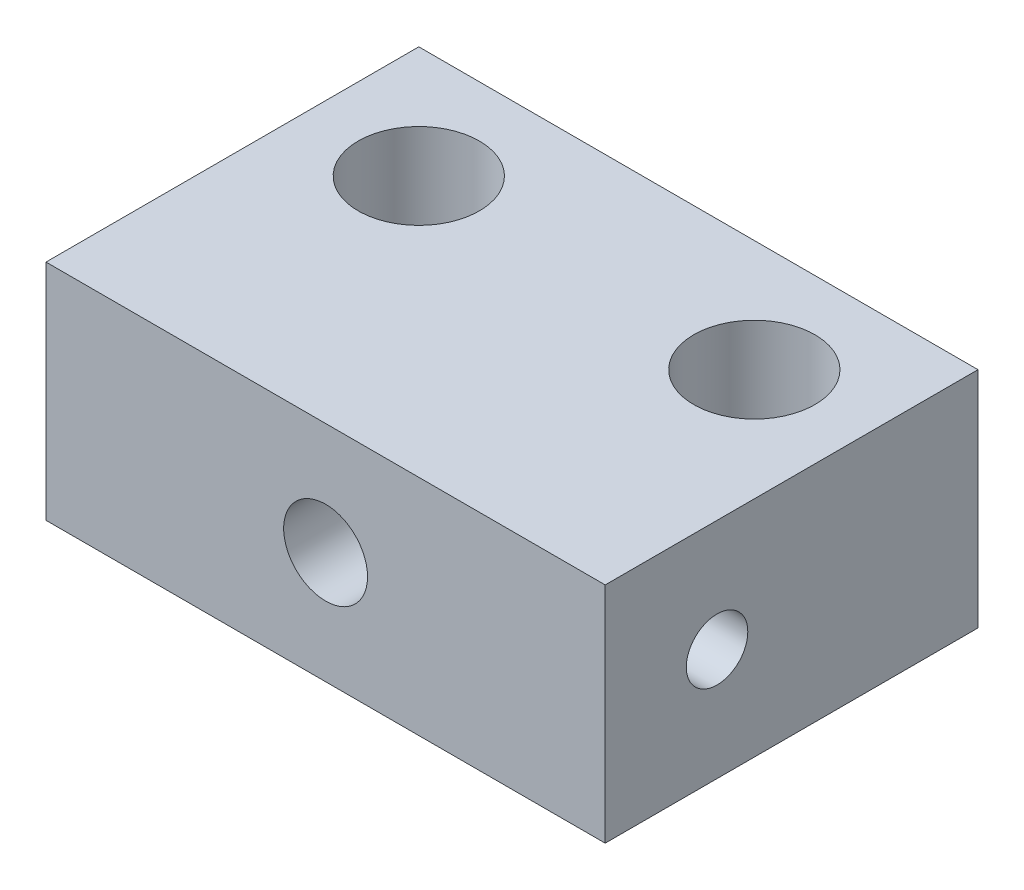
ISO-10303-21;
HEADER;
FILE_DESCRIPTION(('STEP AP214'),'2;1');
FILE_NAME('part.step','',(''),(''),'','','');
FILE_SCHEMA(('AUTOMOTIVE_DESIGN { 1 0 10303 214 1 1 1 1 }'));
ENDSEC;
DATA;
#1=APPLICATION_CONTEXT('core data for automotive mechanical design processes');
#2=APPLICATION_PROTOCOL_DEFINITION('international standard','automotive_design',2000,#1);
#3=PRODUCT_CONTEXT('',#1,'mechanical');
#4=PRODUCT('Part','Part','',(#3));
#5=PRODUCT_RELATED_PRODUCT_CATEGORY('part','',(#4));
#6=PRODUCT_DEFINITION_FORMATION('','',#4);
#7=PRODUCT_DEFINITION_CONTEXT('part definition',#1,'design');
#8=PRODUCT_DEFINITION('design','',#6,#7);
#9=PRODUCT_DEFINITION_SHAPE('','',#8);
#10=(LENGTH_UNIT() NAMED_UNIT(*) SI_UNIT(.MILLI.,.METRE.));
#11=(NAMED_UNIT(*) PLANE_ANGLE_UNIT() SI_UNIT($,.RADIAN.));
#12=(NAMED_UNIT(*) SI_UNIT($,.STERADIAN.) SOLID_ANGLE_UNIT());
#13=UNCERTAINTY_MEASURE_WITH_UNIT(LENGTH_MEASURE(1.E-05),#10,'distance_accuracy_value','');
#14=(GEOMETRIC_REPRESENTATION_CONTEXT(3) GLOBAL_UNCERTAINTY_ASSIGNED_CONTEXT((#13)) GLOBAL_UNIT_ASSIGNED_CONTEXT((#10,
#11,#12)) REPRESENTATION_CONTEXT('',''));
#15=CARTESIAN_POINT('',(0.,0.,0.));
#16=DIRECTION('',(0.,0.,1.));
#17=DIRECTION('',(1.,0.,0.));
#18=AXIS2_PLACEMENT_3D('',#15,#16,#17);
#19=CARTESIAN_POINT('',(15.0000000000001,0.,4.));
#20=DIRECTION('',(1.,0.,0.));
#21=DIRECTION('',(0.,0.,-1.));
#22=AXIS2_PLACEMENT_3D('',#19,#20,#21);
#23=CYLINDRICAL_SURFACE('',#22,1.65);
#24=CARTESIAN_POINT('',(2.25,0.,2.35));
#25=CARTESIAN_POINT('',(2.2499938138554,-0.0810313457488097,2.35000646243822));
#26=CARTESIAN_POINT('',(2.2455777235023,-0.162163120412216,2.35601476654126));
#27=CARTESIAN_POINT('',(2.2283156526284,-0.321859784676765,2.37967490389228));
#28=CARTESIAN_POINT('',(2.21545312282857,-0.40041931653312,2.39734959568061));
#29=CARTESIAN_POINT('',(2.18254266653747,-0.552278539991181,2.44316200012965));
#30=CARTESIAN_POINT('',(2.16253614926498,-0.625605680848924,2.47123944906144));
#31=CARTESIAN_POINT('',(2.11686292416083,-0.766063665025595,2.53656128797815));
#32=CARTESIAN_POINT('',(2.0911970970119,-0.833195470138582,2.57380425176111));
#33=CARTESIAN_POINT('',(2.03332947824902,-0.966337940887485,2.66002002177325));
#34=CARTESIAN_POINT('',(2.00074481564817,-1.03168607871456,2.70975352959745));
#35=CARTESIAN_POINT('',(1.93297687470046,-1.15368201193867,2.817562435368));
#36=CARTESIAN_POINT('',(1.89778965397867,-1.21031619045113,2.87565062017346));
#37=CARTESIAN_POINT('',(1.82032302518825,-1.32459659823451,3.01142025161559));
#38=CARTESIAN_POINT('',(1.7779939118285,-1.38030170191105,3.09071573999114));
#39=CARTESIAN_POINT('',(1.6978630863653,-1.47774276372248,3.25956249568834));
#40=CARTESIAN_POINT('',(1.66005473056947,-1.51949938662037,3.34909832530881));
#41=CARTESIAN_POINT('',(1.60632388084195,-1.57581950437787,3.50629459970161));
#42=CARTESIAN_POINT('',(1.58730710010319,-1.59480773647515,3.57129759323593));
#43=CARTESIAN_POINT('',(1.55659712234633,-1.62479879602515,3.70473151687215));
#44=CARTESIAN_POINT('',(1.54488746299399,-1.63581958241999,3.77315436362934));
#45=CARTESIAN_POINT('',(1.53064274823365,-1.64916353822089,3.91238417550548));
#46=CARTESIAN_POINT('',(1.52817896414053,-1.65141914644185,3.98320543195617));
#47=CARTESIAN_POINT('',(1.53311830759008,-1.64683175479871,4.12422362929993));
#48=CARTESIAN_POINT('',(1.54052819687181,-1.63998251971733,4.19442010917796));
#49=CARTESIAN_POINT('',(1.56509667632076,-1.61656394557399,4.33940034903481));
#50=CARTESIAN_POINT('',(1.58322729672586,-1.59901906139458,4.41385345844059));
#51=CARTESIAN_POINT('',(1.62675933857282,-1.55470663491057,4.55775054873144));
#52=CARTESIAN_POINT('',(1.65217786292627,-1.52791736786163,4.62718225997155));
#53=CARTESIAN_POINT('',(1.71685252849676,-1.45534183294752,4.78378522647734));
#54=CARTESIAN_POINT('',(1.75783963322171,-1.40618840134298,4.86867218352673));
#55=CARTESIAN_POINT('',(1.84176009478718,-1.29434522013681,5.02793483228882));
#56=CARTESIAN_POINT('',(1.88469556428072,-1.2316404854221,5.1022987356816));
#57=CARTESIAN_POINT('',(1.96873902272566,-1.09237400793868,5.24055386478936));
#58=CARTESIAN_POINT('',(2.00981334518455,-1.01563189246386,5.30428528132507));
#59=CARTESIAN_POINT('',(2.08536715797626,-0.849709043259224,5.41793869508471));
#60=CARTESIAN_POINT('',(2.1198596057374,-0.760553359094841,5.46788791302086));
#61=CARTESIAN_POINT('',(2.17092254026151,-0.595843940372056,5.54057918629624));
#62=CARTESIAN_POINT('',(2.18982038546683,-0.522632134340671,5.56701182218384));
#63=CARTESIAN_POINT('',(2.22037725737714,-0.371882781737156,5.60943953485053));
#64=CARTESIAN_POINT('',(2.2320539657079,-0.2943563119907,5.62546011146915));
#65=CARTESIAN_POINT('',(2.2430673521082,-0.180116891709214,5.64053618366884));
#66=CARTESIAN_POINT('',(2.24566055234253,-0.144244427971326,5.64407846760259));
#67=CARTESIAN_POINT('',(2.24912844618746,-0.0722546691467943,5.64881207738097));
#68=CARTESIAN_POINT('',(2.25000275881757,-0.036137321562827,5.65000288203547));
#69=CARTESIAN_POINT('',(2.24999381385548,0.0810313457488343,5.64999353756189));
#70=CARTESIAN_POINT('',(2.24557772350232,0.162163120412238,5.64398523345877));
#71=CARTESIAN_POINT('',(2.22831565262838,0.321859784676792,5.6203250961077));
#72=CARTESIAN_POINT('',(2.21545312282857,0.400419316533155,5.60265040431938));
#73=CARTESIAN_POINT('',(2.18254266653748,0.552278539991224,5.55683799987035));
#74=CARTESIAN_POINT('',(2.16253614926499,0.625605680848969,5.52876055093855));
#75=CARTESIAN_POINT('',(2.11686292416083,0.766063665025639,5.46343871202183));
#76=CARTESIAN_POINT('',(2.0911970970119,0.833195470138623,5.42619574823887));
#77=CARTESIAN_POINT('',(2.03332947824903,0.966337940887523,5.33997997822673));
#78=CARTESIAN_POINT('',(2.00074481564818,1.03168607871459,5.29024647040253));
#79=CARTESIAN_POINT('',(1.93297687470047,1.1536820119387,5.18243756463197));
#80=CARTESIAN_POINT('',(1.89778965397868,1.21031619045117,5.12434937982651));
#81=CARTESIAN_POINT('',(1.82032302518827,1.32459659823454,4.98857974838437));
#82=CARTESIAN_POINT('',(1.77799391182852,1.38030170191108,4.90928426000883));
#83=CARTESIAN_POINT('',(1.69786308636533,1.47774276372251,4.74043750431162));
#84=CARTESIAN_POINT('',(1.66005473056951,1.51949938662039,4.65090167469115));
#85=CARTESIAN_POINT('',(1.60632388084198,1.57581950437789,4.49370540029835));
#86=CARTESIAN_POINT('',(1.58730710010323,1.59480773647517,4.42870240676402));
#87=CARTESIAN_POINT('',(1.55659712234638,1.62479879602516,4.2952684831278));
#88=CARTESIAN_POINT('',(1.54488746299404,1.63581958242,4.22684563637061));
#89=CARTESIAN_POINT('',(1.53064274823371,1.6491635382209,4.08761582449447));
#90=CARTESIAN_POINT('',(1.52817896414059,1.65141914644185,4.01679456804378));
#91=CARTESIAN_POINT('',(1.53311830759015,1.64683175479871,3.87577637070001));
#92=CARTESIAN_POINT('',(1.54052819687188,1.63998251971732,3.80557989082199));
#93=CARTESIAN_POINT('',(1.56509667632083,1.61656394557398,3.66059965096514));
#94=CARTESIAN_POINT('',(1.58322729672593,1.59901906139456,3.58614654155935));
#95=CARTESIAN_POINT('',(1.62675933857289,1.55470663491054,3.44224945126849));
#96=CARTESIAN_POINT('',(1.65217786292635,1.5279173678616,3.37281774002837));
#97=CARTESIAN_POINT('',(1.71685252849684,1.45534183294747,3.21621477352259));
#98=CARTESIAN_POINT('',(1.75783963322179,1.40618840134293,3.13132781647319));
#99=CARTESIAN_POINT('',(1.84176009478726,1.29434522013675,2.97206516771112));
#100=CARTESIAN_POINT('',(1.8846955642808,1.23164048542204,2.89770126431833));
#101=CARTESIAN_POINT('',(1.96873902272573,1.0923740079386,2.75944613521058));
#102=CARTESIAN_POINT('',(2.00981334518462,1.01563189246378,2.69571471867487));
#103=CARTESIAN_POINT('',(2.08536715797632,0.849709043259134,2.58206130491524));
#104=CARTESIAN_POINT('',(2.11985960573745,0.760553359094744,2.5321120869791));
#105=CARTESIAN_POINT('',(2.17092254026155,0.595843940371949,2.45942081370372));
#106=CARTESIAN_POINT('',(2.18982038546687,0.522632134340562,2.43298817781612));
#107=CARTESIAN_POINT('',(2.22037725737716,0.371882781737046,2.39056046514945));
#108=CARTESIAN_POINT('',(2.23205396570792,0.294356311990593,2.37453988853085));
#109=CARTESIAN_POINT('',(2.24306735210821,0.180116891709135,2.35946381633116));
#110=CARTESIAN_POINT('',(2.24566055234255,0.14424442797127,2.3559215323974));
#111=CARTESIAN_POINT('',(2.24912844618745,0.0722546691467816,2.35118792261905));
#112=CARTESIAN_POINT('',(2.25000275881753,0.0361373215628343,2.34999711796459));
#113=CARTESIAN_POINT('',(2.25,0.,2.35));
#114=B_SPLINE_CURVE_WITH_KNOTS('',3,(#24,#25,#26,#27,#28,#29,#30,#31,#32,#33,#34,#35,#36,#37,
#38,#39,#40,#41,#42,#43,#44,#45,#46,#47,#48,#49,#50,#51,#52,#53,#54,#55,#56,#57,#58,#59,#60,#61,
#62,#63,#64,#65,#66,#67,#68,#69,#70,#71,#72,#73,#74,#75,#76,#77,#78,#79,#80,#81,#82,#83,#84,#85,
#86,#87,#88,#89,#90,#91,#92,#93,#94,#95,#96,#97,#98,#99,#100,#101,#102,#103,#104,#105,#106,#107,
#108,#109,#110,#111,#112,#113),.UNSPECIFIED.,.T.,.F.,(4,2,2,2,2,2,2,2,2,2,2,2,2,2,2,2,2,2,2,2,2,
2,2,2,2,2,2,2,2,2,2,2,2,2,2,2,2,2,2,2,2,2,2,2,4),(0.,0.242939915417061,0.486357253868472,
0.728385966334093,0.970377041654623,1.2344723515084,1.49897624834314,1.81486929392014,
2.13029224456473,2.34056736662707,2.5503670296909,2.7617806385647,2.97333910321245,
3.20789135785873,3.44299861833375,3.76030004827093,4.07795416397843,4.40002040674048,
4.72144591941894,4.96077617539002,5.19951806427572,5.30783729012436,5.41618052153372,
5.65912043695078,5.90253777540221,6.14456648786784,6.38655756318836,6.65065287304214,
6.91515676987688,7.23104981545388,7.54647276609846,7.75674788816081,7.96654755122464,
8.17796116009844,8.38951962474619,8.62407187939249,8.85917913986752,9.1764805698047,
9.49413468551221,9.81620092827425,10.1376264409527,10.3769566969238,10.6156985858095,
10.7240178116581,10.8323610430673),.UNSPECIFIED.);
#115=CARTESIAN_POINT('',(2.25,0.,2.35));
#116=VERTEX_POINT('',#115);
#117=EDGE_CURVE('E20',#116,#116,#114,.T.);
#118=ORIENTED_EDGE('',*,*,#117,.T.);
#119=EDGE_LOOP('',(#118));
#120=FACE_BOUND('',#119,.T.);
#121=CARTESIAN_POINT('',(15.0000000000001,0.,4.));
#122=DIRECTION('',(1.,0.,0.));
#123=DIRECTION('',(0.,0.,-1.));
#124=AXIS2_PLACEMENT_3D('',#121,#122,#123);
#125=CIRCLE('',#124,1.65);
#126=CARTESIAN_POINT('',(15.0000000000001,0.,2.35));
#127=VERTEX_POINT('',#126);
#128=EDGE_CURVE('E85',#127,#127,#125,.T.);
#129=ORIENTED_EDGE('',*,*,#128,.T.);
#130=EDGE_LOOP('',(#129));
#131=FACE_BOUND('',#130,.T.);
#132=ADVANCED_FACE('F16',(#120,#131),#23,.F.);
#133=CARTESIAN_POINT('',(-14.9999999999999,6.00000000000003,10.));
#134=DIRECTION('',(0.,-1.,0.));
#135=DIRECTION('',(1.,0.,0.));
#136=AXIS2_PLACEMENT_3D('',#133,#134,#135);
#137=PLANE('',#136);
#138=DIRECTION('',(0.,0.,1.));
#139=VECTOR('',#138,1.);
#140=CARTESIAN_POINT('',(-14.9999999999999,6.,9.99999999999999));
#141=LINE('',#140,#139);
#142=CARTESIAN_POINT('',(-15.,6.00000000000001,-10.0000000000001));
#143=VERTEX_POINT('',#142);
#144=CARTESIAN_POINT('',(-14.9999999999999,6.00000000000002,10.));
#145=VERTEX_POINT('',#144);
#146=EDGE_CURVE('E73',#143,#145,#141,.T.);
#147=ORIENTED_EDGE('',*,*,#146,.T.);
#148=DIRECTION('',(-1.,0.,0.));
#149=VECTOR('',#148,1.);
#150=CARTESIAN_POINT('',(-14.9999999999999,6.00000000000003,9.99999999999999));
#151=LINE('',#150,#149);
#152=CARTESIAN_POINT('',(15.0000000000001,6.00000000000003,10.));
#153=VERTEX_POINT('',#152);
#154=EDGE_CURVE('E59',#145,#153,#151,.F.);
#155=ORIENTED_EDGE('',*,*,#154,.T.);
#156=DIRECTION('',(0.,0.,1.));
#157=VECTOR('',#156,1.);
#158=CARTESIAN_POINT('',(15.0000000000001,6.00000000000002,9.99999999999999));
#159=LINE('',#158,#157);
#160=CARTESIAN_POINT('',(15.,6.00000000000002,-10.0000000000001));
#161=VERTEX_POINT('',#160);
#162=EDGE_CURVE('E259',#153,#161,#159,.F.);
#163=ORIENTED_EDGE('',*,*,#162,.T.);
#164=DIRECTION('',(-1.,0.,0.));
#165=VECTOR('',#164,1.);
#166=CARTESIAN_POINT('',(-15.0000000000001,6.,-10.0000000000001));
#167=LINE('',#166,#165);
#168=EDGE_CURVE('E76',#143,#161,#167,.F.);
#169=ORIENTED_EDGE('',*,*,#168,.F.);
#170=EDGE_LOOP('',(#147,#155,#163,#169));
#171=FACE_BOUND('',#170,.T.);
#172=CARTESIAN_POINT('',(8.9999999999999,6.00000000000002,-4.00000000000005));
#173=DIRECTION('',(0.,1.,0.));
#174=DIRECTION('',(-1.,0.,0.));
#175=AXIS2_PLACEMENT_3D('',#172,#173,#174);
#176=CIRCLE('',#175,3.25000000000001);
#177=CARTESIAN_POINT('',(5.74999999999989,6.00000000000002,-4.00000000000005));
#178=VERTEX_POINT('',#177);
#179=EDGE_CURVE('E80',#178,#178,#176,.F.);
#180=ORIENTED_EDGE('',*,*,#179,.T.);
#181=EDGE_LOOP('',(#180));
#182=FACE_BOUND('',#181,.T.);
#183=CARTESIAN_POINT('',(-9.00000000000012,6.00000000000003,-4.00000000000005));
#184=DIRECTION('',(0.,1.,0.));
#185=DIRECTION('',(-1.,0.,0.));
#186=AXIS2_PLACEMENT_3D('',#183,#184,#185);
#187=CIRCLE('',#186,3.25000000000001);
#188=CARTESIAN_POINT('',(-12.2500000000001,6.00000000000003,-4.00000000000005));
#189=VERTEX_POINT('',#188);
#190=EDGE_CURVE('E104',#189,#189,#187,.F.);
#191=ORIENTED_EDGE('',*,*,#190,.T.);
#192=EDGE_LOOP('',(#191));
#193=FACE_BOUND('',#192,.T.);
#194=ADVANCED_FACE('F74',(#171,#182,#193),#137,.F.);
#195=CARTESIAN_POINT('',(0.,0.,10.));
#196=DIRECTION('',(0.,0.,1.));
#197=DIRECTION('',(1.,0.,0.));
#198=AXIS2_PLACEMENT_3D('',#195,#196,#197);
#199=CYLINDRICAL_SURFACE('',#198,2.25);
#200=ORIENTED_EDGE('',*,*,#117,.F.);
#201=EDGE_LOOP('',(#200));
#202=FACE_BOUND('',#201,.T.);
#203=CARTESIAN_POINT('',(0.,0.,10.));
#204=DIRECTION('',(0.,0.,1.));
#205=DIRECTION('',(1.,0.,0.));
#206=AXIS2_PLACEMENT_3D('',#203,#204,#205);
#207=CIRCLE('',#206,2.25);
#208=CARTESIAN_POINT('',(2.25,0.,10.));
#209=VERTEX_POINT('',#208);
#210=EDGE_CURVE('E70',#209,#209,#207,.T.);
#211=ORIENTED_EDGE('',*,*,#210,.T.);
#212=EDGE_LOOP('',(#211));
#213=FACE_BOUND('',#212,.T.);
#214=CARTESIAN_POINT('',(0.,0.,-10.0000000000001));
#215=DIRECTION('',(0.,0.,1.));
#216=DIRECTION('',(1.,0.,0.));
#217=AXIS2_PLACEMENT_3D('',#214,#215,#216);
#218=CIRCLE('',#217,2.25);
#219=CARTESIAN_POINT('',(2.25,0.,-10.0000000000001));
#220=VERTEX_POINT('',#219);
#221=EDGE_CURVE('E98',#220,#220,#218,.T.);
#222=ORIENTED_EDGE('',*,*,#221,.F.);
#223=EDGE_LOOP('',(#222));
#224=FACE_BOUND('',#223,.T.);
#225=ADVANCED_FACE('F113',(#202,#213,#224),#199,.F.);
#226=CARTESIAN_POINT('',(-9.00000000000012,6.00000000000003,-4.00000000000005));
#227=DIRECTION('',(0.,1.,0.));
#228=DIRECTION('',(-1.,0.,0.));
#229=AXIS2_PLACEMENT_3D('',#226,#227,#228);
#230=CYLINDRICAL_SURFACE('',#229,3.25000000000001);
#231=CARTESIAN_POINT('',(-9.00000000000012,-6.00000000000005,-4.00000000000005));
#232=DIRECTION('',(0.,1.,0.));
#233=DIRECTION('',(-1.,0.,0.));
#234=AXIS2_PLACEMENT_3D('',#231,#232,#233);
#235=CIRCLE('',#234,3.25000000000001);
#236=CARTESIAN_POINT('',(-12.2500000000001,-6.00000000000005,-4.00000000000005));
#237=VERTEX_POINT('',#236);
#238=EDGE_CURVE('E95',#237,#237,#235,.F.);
#239=ORIENTED_EDGE('',*,*,#238,.T.);
#240=EDGE_LOOP('',(#239));
#241=FACE_BOUND('',#240,.T.);
#242=ORIENTED_EDGE('',*,*,#190,.F.);
#243=EDGE_LOOP('',(#242));
#244=FACE_BOUND('',#243,.T.);
#245=ADVANCED_FACE('F116',(#241,#244),#230,.F.);
#246=CARTESIAN_POINT('',(8.9999999999999,6.00000000000002,-4.00000000000005));
#247=DIRECTION('',(0.,1.,0.));
#248=DIRECTION('',(-1.,0.,0.));
#249=AXIS2_PLACEMENT_3D('',#246,#247,#248);
#250=CYLINDRICAL_SURFACE('',#249,3.25000000000001);
#251=CARTESIAN_POINT('',(8.9999999999999,-6.00000000000005,-4.00000000000005));
#252=DIRECTION('',(0.,1.,0.));
#253=DIRECTION('',(-1.,0.,0.));
#254=AXIS2_PLACEMENT_3D('',#251,#252,#253);
#255=CIRCLE('',#254,3.25000000000001);
#256=CARTESIAN_POINT('',(5.74999999999989,-6.00000000000005,-4.00000000000005));
#257=VERTEX_POINT('',#256);
#258=EDGE_CURVE('E92',#257,#257,#255,.F.);
#259=ORIENTED_EDGE('',*,*,#258,.T.);
#260=EDGE_LOOP('',(#259));
#261=FACE_BOUND('',#260,.T.);
#262=ORIENTED_EDGE('',*,*,#179,.F.);
#263=EDGE_LOOP('',(#262));
#264=FACE_BOUND('',#263,.T.);
#265=ADVANCED_FACE('F140',(#261,#264),#250,.F.);
#266=CARTESIAN_POINT('',(-14.9999999999999,-6.00000000000001,9.99999999999999));
#267=DIRECTION('',(1.,0.,0.));
#268=DIRECTION('',(0.,1.,0.));
#269=AXIS2_PLACEMENT_3D('',#266,#267,#268);
#270=PLANE('',#269);
#271=DIRECTION('',(0.,0.,1.));
#272=VECTOR('',#271,1.);
#273=CARTESIAN_POINT('',(-15.0000000000001,-6.00000000000001,9.99999999999999));
#274=LINE('',#273,#272);
#275=CARTESIAN_POINT('',(-15.,-6.00000000000002,-10.0000000000001));
#276=VERTEX_POINT('',#275);
#277=CARTESIAN_POINT('',(-15.,-6.00000000000001,10.));
#278=VERTEX_POINT('',#277);
#279=EDGE_CURVE('E84',#276,#278,#274,.T.);
#280=ORIENTED_EDGE('',*,*,#279,.T.);
#281=DIRECTION('',(0.,1.,0.));
#282=VECTOR('',#281,1.);
#283=CARTESIAN_POINT('',(-14.9999999999999,-6.00000000000001,9.99999999999999));
#284=LINE('',#283,#282);
#285=EDGE_CURVE('E67',#278,#145,#284,.T.);
#286=ORIENTED_EDGE('',*,*,#285,.T.);
#287=ORIENTED_EDGE('',*,*,#146,.F.);
#288=DIRECTION('',(0.,1.,0.));
#289=VECTOR('',#288,1.);
#290=CARTESIAN_POINT('',(-15.0000000000001,-6.00000000000005,-10.0000000000001));
#291=LINE('',#290,#289);
#292=EDGE_CURVE('E263',#276,#143,#291,.T.);
#293=ORIENTED_EDGE('',*,*,#292,.F.);
#294=EDGE_LOOP('',(#280,#286,#287,#293));
#295=FACE_BOUND('',#294,.T.);
#296=ADVANCED_FACE('F83',(#295),#270,.F.);
#297=CARTESIAN_POINT('',(-14.9999999999999,-6.00000000000001,9.99999999999999));
#298=DIRECTION('',(0.,0.,-1.));
#299=DIRECTION('',(-1.,0.,0.));
#300=AXIS2_PLACEMENT_3D('',#297,#298,#299);
#301=PLANE('',#300);
#302=DIRECTION('',(-1.,0.,0.));
#303=VECTOR('',#302,1.);
#304=CARTESIAN_POINT('',(-14.9999999999999,-6.00000000000001,9.99999999999999));
#305=LINE('',#304,#303);
#306=CARTESIAN_POINT('',(15.0000000000001,-6.00000000000002,9.99999999999999));
#307=VERTEX_POINT('',#306);
#308=EDGE_CURVE('E269',#278,#307,#305,.F.);
#309=ORIENTED_EDGE('',*,*,#308,.T.);
#310=DIRECTION('',(0.,-1.,0.));
#311=VECTOR('',#310,1.);
#312=CARTESIAN_POINT('',(15.0000000000001,-6.00000000000001,9.99999999999999));
#313=LINE('',#312,#311);
#314=EDGE_CURVE('E69',#307,#153,#313,.F.);
#315=ORIENTED_EDGE('',*,*,#314,.T.);
#316=ORIENTED_EDGE('',*,*,#154,.F.);
#317=ORIENTED_EDGE('',*,*,#285,.F.);
#318=EDGE_LOOP('',(#309,#315,#316,#317));
#319=FACE_BOUND('',#318,.T.);
#320=ORIENTED_EDGE('',*,*,#210,.F.);
#321=EDGE_LOOP('',(#320));
#322=FACE_BOUND('',#321,.T.);
#323=ADVANCED_FACE('F64',(#319,#322),#301,.F.);
#324=CARTESIAN_POINT('',(15.0000000000001,-6.00000000000001,9.99999999999999));
#325=DIRECTION('',(-1.,0.,0.));
#326=DIRECTION('',(0.,-1.,0.));
#327=AXIS2_PLACEMENT_3D('',#324,#325,#326);
#328=PLANE('',#327);
#329=ORIENTED_EDGE('',*,*,#162,.F.);
#330=ORIENTED_EDGE('',*,*,#314,.F.);
#331=DIRECTION('',(0.,0.,1.));
#332=VECTOR('',#331,1.);
#333=CARTESIAN_POINT('',(15.0000000000001,-6.00000000000001,9.99999999999999));
#334=LINE('',#333,#332);
#335=CARTESIAN_POINT('',(15.0000000000001,-6.00000000000004,-10.0000000000001));
#336=VERTEX_POINT('',#335);
#337=EDGE_CURVE('E30',#307,#336,#334,.F.);
#338=ORIENTED_EDGE('',*,*,#337,.T.);
#339=DIRECTION('',(0.,1.,0.));
#340=VECTOR('',#339,1.);
#341=CARTESIAN_POINT('',(14.9999999999999,-6.00000000000005,-10.0000000000001));
#342=LINE('',#341,#340);
#343=EDGE_CURVE('E38',#161,#336,#342,.F.);
#344=ORIENTED_EDGE('',*,*,#343,.F.);
#345=EDGE_LOOP('',(#329,#330,#338,#344));
#346=FACE_BOUND('',#345,.T.);
#347=ORIENTED_EDGE('',*,*,#128,.F.);
#348=EDGE_LOOP('',(#347));
#349=FACE_BOUND('',#348,.T.);
#350=ADVANCED_FACE('F124',(#346,#349),#328,.F.);
#351=CARTESIAN_POINT('',(-15.0000000000001,-6.00000000000005,-10.0000000000001));
#352=DIRECTION('',(0.,0.,-1.));
#353=DIRECTION('',(-1.,0.,0.));
#354=AXIS2_PLACEMENT_3D('',#351,#352,#353);
#355=PLANE('',#354);
#356=ORIENTED_EDGE('',*,*,#221,.T.);
#357=EDGE_LOOP('',(#356));
#358=FACE_BOUND('',#357,.T.);
#359=ORIENTED_EDGE('',*,*,#343,.T.);
#360=DIRECTION('',(-1.,0.,0.));
#361=VECTOR('',#360,1.);
#362=CARTESIAN_POINT('',(-14.9999999999999,-6.00000000000001,-10.0000000000001));
#363=LINE('',#362,#361);
#364=EDGE_CURVE('E11',#336,#276,#363,.T.);
#365=ORIENTED_EDGE('',*,*,#364,.T.);
#366=ORIENTED_EDGE('',*,*,#292,.T.);
#367=ORIENTED_EDGE('',*,*,#168,.T.);
#368=EDGE_LOOP('',(#359,#365,#366,#367));
#369=FACE_BOUND('',#368,.T.);
#370=ADVANCED_FACE('F121',(#358,#369),#355,.T.);
#371=CARTESIAN_POINT('',(-14.9999999999999,-6.00000000000001,9.99999999999999));
#372=DIRECTION('',(0.,1.,0.));
#373=DIRECTION('',(-1.,0.,0.));
#374=AXIS2_PLACEMENT_3D('',#371,#372,#373);
#375=PLANE('',#374);
#376=ORIENTED_EDGE('',*,*,#337,.F.);
#377=ORIENTED_EDGE('',*,*,#308,.F.);
#378=ORIENTED_EDGE('',*,*,#279,.F.);
#379=ORIENTED_EDGE('',*,*,#364,.F.);
#380=EDGE_LOOP('',(#376,#377,#378,#379));
#381=FACE_BOUND('',#380,.T.);
#382=ORIENTED_EDGE('',*,*,#258,.F.);
#383=EDGE_LOOP('',(#382));
#384=FACE_BOUND('',#383,.T.);
#385=ORIENTED_EDGE('',*,*,#238,.F.);
#386=EDGE_LOOP('',(#385));
#387=FACE_BOUND('',#386,.T.);
#388=ADVANCED_FACE('F123',(#381,#384,#387),#375,.F.);
#389=CLOSED_SHELL('',(#132,#194,#225,#245,#265,#296,#323,#350,#370,#388));
#390=MANIFOLD_SOLID_BREP('B1',#389);
#391=ADVANCED_BREP_SHAPE_REPRESENTATION('',(#18,#390),#14);
#392=SHAPE_DEFINITION_REPRESENTATION(#9,#391);
ENDSEC;
END-ISO-10303-21;
